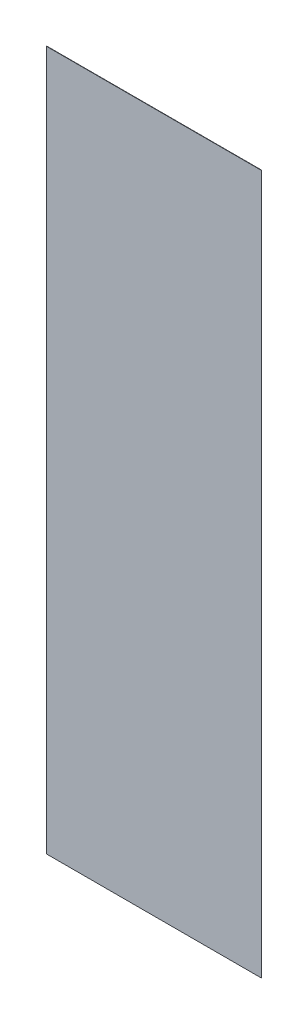
ISO-10303-21;
HEADER;
FILE_DESCRIPTION(('STEP AP214'),'2;1');
FILE_NAME('part.step','',(''),(''),'','','');
FILE_SCHEMA(('AUTOMOTIVE_DESIGN { 1 0 10303 214 1 1 1 1 }'));
ENDSEC;
DATA;
#1=APPLICATION_CONTEXT('core data for automotive mechanical design processes');
#2=APPLICATION_PROTOCOL_DEFINITION('international standard','automotive_design',2000,#1);
#3=PRODUCT_CONTEXT('',#1,'mechanical');
#4=PRODUCT('Part','Part','',(#3));
#5=PRODUCT_RELATED_PRODUCT_CATEGORY('part','',(#4));
#6=PRODUCT_DEFINITION_FORMATION('','',#4);
#7=PRODUCT_DEFINITION_CONTEXT('part definition',#1,'design');
#8=PRODUCT_DEFINITION('design','',#6,#7);
#9=PRODUCT_DEFINITION_SHAPE('','',#8);
#10=(LENGTH_UNIT() NAMED_UNIT(*) SI_UNIT(.MILLI.,.METRE.));
#11=(NAMED_UNIT(*) PLANE_ANGLE_UNIT() SI_UNIT($,.RADIAN.));
#12=(NAMED_UNIT(*) SI_UNIT($,.STERADIAN.) SOLID_ANGLE_UNIT());
#13=UNCERTAINTY_MEASURE_WITH_UNIT(LENGTH_MEASURE(1.E-05),#10,'distance_accuracy_value','');
#14=(GEOMETRIC_REPRESENTATION_CONTEXT(3) GLOBAL_UNCERTAINTY_ASSIGNED_CONTEXT((#13)) GLOBAL_UNIT_ASSIGNED_CONTEXT((#10,
#11,#12)) REPRESENTATION_CONTEXT('',''));
#15=CARTESIAN_POINT('',(0.,0.,0.));
#16=DIRECTION('',(0.,0.,1.));
#17=DIRECTION('',(1.,0.,0.));
#18=AXIS2_PLACEMENT_3D('',#15,#16,#17);
#19=CARTESIAN_POINT('',(0.,0.,1.21));
#20=DIRECTION('',(1.,0.,0.));
#21=DIRECTION('',(0.,1.,0.));
#22=AXIS2_PLACEMENT_3D('',#19,#20,#21);
#23=PLANE('',#22);
#24=DIRECTION('',(0.,-1.,0.));
#25=VECTOR('',#24,1.);
#26=CARTESIAN_POINT('',(0.,0.,0.));
#27=LINE('',#26,#25);
#28=CARTESIAN_POINT('',(0.,0.,0.));
#29=VERTEX_POINT('',#28);
#30=CARTESIAN_POINT('',(2.98813818991954E-13,-2440.,0.));
#31=VERTEX_POINT('',#30);
#32=EDGE_CURVE('E99',#29,#31,#27,.T.);
#33=ORIENTED_EDGE('',*,*,#32,.T.);
#34=DIRECTION('',(0.,0.,-1.));
#35=VECTOR('',#34,1.);
#36=CARTESIAN_POINT('',(2.98813818991954E-13,-2440.,1.21));
#37=LINE('',#36,#35);
#38=CARTESIAN_POINT('',(2.98813818991954E-13,-2440.,1.21));
#39=VERTEX_POINT('',#38);
#40=EDGE_CURVE('E11',#39,#31,#37,.T.);
#41=ORIENTED_EDGE('',*,*,#40,.F.);
#42=DIRECTION('',(0.,-1.,0.));
#43=VECTOR('',#42,1.);
#44=CARTESIAN_POINT('',(0.,0.,1.21));
#45=LINE('',#44,#43);
#46=CARTESIAN_POINT('',(0.,0.,1.21));
#47=VERTEX_POINT('',#46);
#48=EDGE_CURVE('E87',#47,#39,#45,.T.);
#49=ORIENTED_EDGE('',*,*,#48,.F.);
#50=DIRECTION('',(0.,0.,-1.));
#51=VECTOR('',#50,1.);
#52=CARTESIAN_POINT('',(0.,0.,1.21));
#53=LINE('',#52,#51);
#54=EDGE_CURVE('E95',#47,#29,#53,.T.);
#55=ORIENTED_EDGE('',*,*,#54,.T.);
#56=EDGE_LOOP('',(#33,#41,#49,#55));
#57=FACE_BOUND('',#56,.T.);
#58=ADVANCED_FACE('F36',(#57),#23,.F.);
#59=CARTESIAN_POINT('',(2.98813818991954E-13,-2440.,1.21));
#60=DIRECTION('',(0.,1.,0.));
#61=DIRECTION('',(0.,0.,1.));
#62=AXIS2_PLACEMENT_3D('',#59,#60,#61);
#63=PLANE('',#62);
#64=DIRECTION('',(1.,0.,0.));
#65=VECTOR('',#64,1.);
#66=CARTESIAN_POINT('',(2.98813818991954E-13,-2440.,0.));
#67=LINE('',#66,#65);
#68=CARTESIAN_POINT('',(750.,-2440.,0.));
#69=VERTEX_POINT('',#68);
#70=EDGE_CURVE('E91',#31,#69,#67,.T.);
#71=ORIENTED_EDGE('',*,*,#70,.T.);
#72=DIRECTION('',(0.,0.,-1.));
#73=VECTOR('',#72,1.);
#74=CARTESIAN_POINT('',(750.,-2440.,1.21));
#75=LINE('',#74,#73);
#76=CARTESIAN_POINT('',(750.,-2440.,1.21));
#77=VERTEX_POINT('',#76);
#78=EDGE_CURVE('E44',#77,#69,#75,.T.);
#79=ORIENTED_EDGE('',*,*,#78,.F.);
#80=DIRECTION('',(1.,0.,0.));
#81=VECTOR('',#80,1.);
#82=CARTESIAN_POINT('',(2.98813818991954E-13,-2440.,1.21));
#83=LINE('',#82,#81);
#84=EDGE_CURVE('E82',#39,#77,#83,.T.);
#85=ORIENTED_EDGE('',*,*,#84,.F.);
#86=ORIENTED_EDGE('',*,*,#40,.T.);
#87=EDGE_LOOP('',(#71,#79,#85,#86));
#88=FACE_BOUND('',#87,.T.);
#89=ADVANCED_FACE('F90',(#88),#63,.F.);
#90=CARTESIAN_POINT('',(750.,0.,1.21));
#91=DIRECTION('',(-1.,0.,0.));
#92=DIRECTION('',(0.,-1.,0.));
#93=AXIS2_PLACEMENT_3D('',#90,#91,#92);
#94=PLANE('',#93);
#95=DIRECTION('',(0.,1.,0.));
#96=VECTOR('',#95,1.);
#97=CARTESIAN_POINT('',(750.,0.,0.));
#98=LINE('',#97,#96);
#99=CARTESIAN_POINT('',(750.,0.,0.));
#100=VERTEX_POINT('',#99);
#101=EDGE_CURVE('E69',#69,#100,#98,.T.);
#102=ORIENTED_EDGE('',*,*,#101,.T.);
#103=DIRECTION('',(0.,0.,-1.));
#104=VECTOR('',#103,1.);
#105=CARTESIAN_POINT('',(750.,0.,1.21));
#106=LINE('',#105,#104);
#107=CARTESIAN_POINT('',(750.,0.,1.21));
#108=VERTEX_POINT('',#107);
#109=EDGE_CURVE('E92',#108,#100,#106,.T.);
#110=ORIENTED_EDGE('',*,*,#109,.F.);
#111=DIRECTION('',(0.,1.,0.));
#112=VECTOR('',#111,1.);
#113=CARTESIAN_POINT('',(750.,0.,1.21));
#114=LINE('',#113,#112);
#115=EDGE_CURVE('E85',#77,#108,#114,.T.);
#116=ORIENTED_EDGE('',*,*,#115,.F.);
#117=ORIENTED_EDGE('',*,*,#78,.T.);
#118=EDGE_LOOP('',(#102,#110,#116,#117));
#119=FACE_BOUND('',#118,.T.);
#120=ADVANCED_FACE('F93',(#119),#94,.F.);
#121=CARTESIAN_POINT('',(0.,0.,1.21));
#122=DIRECTION('',(0.,-1.,0.));
#123=DIRECTION('',(0.,0.,-1.));
#124=AXIS2_PLACEMENT_3D('',#121,#122,#123);
#125=PLANE('',#124);
#126=DIRECTION('',(-1.,0.,0.));
#127=VECTOR('',#126,1.);
#128=CARTESIAN_POINT('',(0.,0.,0.));
#129=LINE('',#128,#127);
#130=EDGE_CURVE('E75',#100,#29,#129,.T.);
#131=ORIENTED_EDGE('',*,*,#130,.T.);
#132=ORIENTED_EDGE('',*,*,#54,.F.);
#133=DIRECTION('',(-1.,0.,0.));
#134=VECTOR('',#133,1.);
#135=CARTESIAN_POINT('',(0.,0.,1.21));
#136=LINE('',#135,#134);
#137=EDGE_CURVE('E52',#108,#47,#136,.T.);
#138=ORIENTED_EDGE('',*,*,#137,.F.);
#139=ORIENTED_EDGE('',*,*,#109,.T.);
#140=EDGE_LOOP('',(#131,#132,#138,#139));
#141=FACE_BOUND('',#140,.T.);
#142=ADVANCED_FACE('F106',(#141),#125,.F.);
#143=CARTESIAN_POINT('',(0.,0.,1.21));
#144=DIRECTION('',(0.,0.,1.));
#145=DIRECTION('',(1.,0.,0.));
#146=AXIS2_PLACEMENT_3D('',#143,#144,#145);
#147=PLANE('',#146);
#148=ORIENTED_EDGE('',*,*,#48,.T.);
#149=ORIENTED_EDGE('',*,*,#84,.T.);
#150=ORIENTED_EDGE('',*,*,#115,.T.);
#151=ORIENTED_EDGE('',*,*,#137,.T.);
#152=EDGE_LOOP('',(#148,#149,#150,#151));
#153=FACE_BOUND('',#152,.T.);
#154=ADVANCED_FACE('F83',(#153),#147,.T.);
#155=CARTESIAN_POINT('',(0.,0.,0.));
#156=DIRECTION('',(0.,0.,1.));
#157=DIRECTION('',(1.,0.,0.));
#158=AXIS2_PLACEMENT_3D('',#155,#156,#157);
#159=PLANE('',#158);
#160=ORIENTED_EDGE('',*,*,#32,.F.);
#161=ORIENTED_EDGE('',*,*,#130,.F.);
#162=ORIENTED_EDGE('',*,*,#101,.F.);
#163=ORIENTED_EDGE('',*,*,#70,.F.);
#164=EDGE_LOOP('',(#160,#161,#162,#163));
#165=FACE_BOUND('',#164,.T.);
#166=ADVANCED_FACE('F109',(#165),#159,.F.);
#167=CLOSED_SHELL('',(#58,#89,#120,#142,#154,#166));
#168=MANIFOLD_SOLID_BREP('B2',#167);
#169=ADVANCED_BREP_SHAPE_REPRESENTATION('',(#18,#168),#14);
#170=SHAPE_DEFINITION_REPRESENTATION(#9,#169);
ENDSEC;
END-ISO-10303-21;
